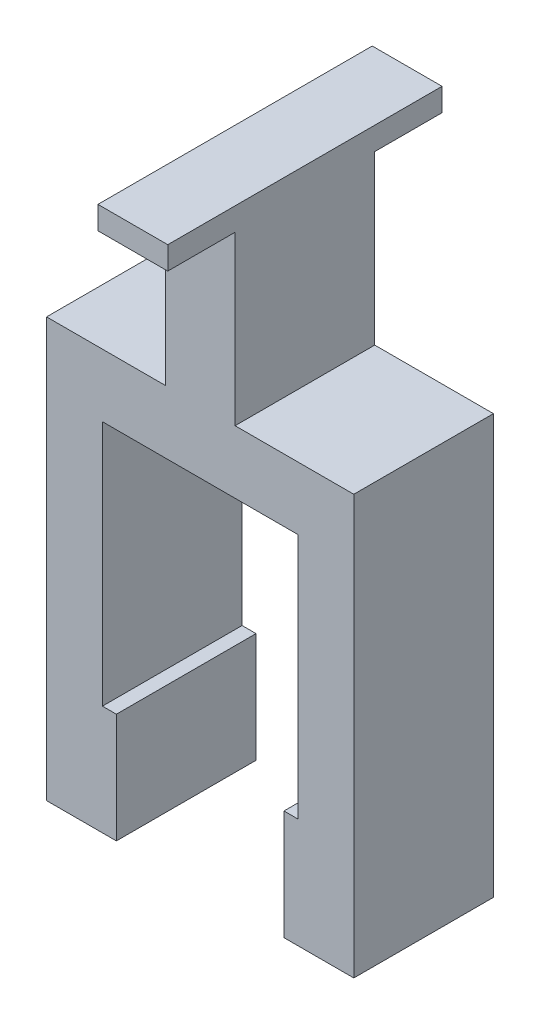
ISO-10303-21;
HEADER;
FILE_DESCRIPTION(('STEP AP214'),'2;1');
FILE_NAME('part.step','',(''),(''),'','','');
FILE_SCHEMA(('AUTOMOTIVE_DESIGN { 1 0 10303 214 1 1 1 1 }'));
ENDSEC;
DATA;
#1=APPLICATION_CONTEXT('core data for automotive mechanical design processes');
#2=APPLICATION_PROTOCOL_DEFINITION('international standard','automotive_design',2000,#1);
#3=PRODUCT_CONTEXT('',#1,'mechanical');
#4=PRODUCT('Part','Part','',(#3));
#5=PRODUCT_RELATED_PRODUCT_CATEGORY('part','',(#4));
#6=PRODUCT_DEFINITION_FORMATION('','',#4);
#7=PRODUCT_DEFINITION_CONTEXT('part definition',#1,'design');
#8=PRODUCT_DEFINITION('design','',#6,#7);
#9=PRODUCT_DEFINITION_SHAPE('','',#8);
#10=(LENGTH_UNIT() NAMED_UNIT(*) SI_UNIT(.MILLI.,.METRE.));
#11=(NAMED_UNIT(*) PLANE_ANGLE_UNIT() SI_UNIT($,.RADIAN.));
#12=(NAMED_UNIT(*) SI_UNIT($,.STERADIAN.) SOLID_ANGLE_UNIT());
#13=UNCERTAINTY_MEASURE_WITH_UNIT(LENGTH_MEASURE(1.E-05),#10,'distance_accuracy_value','');
#14=(GEOMETRIC_REPRESENTATION_CONTEXT(3) GLOBAL_UNCERTAINTY_ASSIGNED_CONTEXT((#13)) GLOBAL_UNIT_ASSIGNED_CONTEXT((#10,
#11,#12)) REPRESENTATION_CONTEXT('',''));
#15=CARTESIAN_POINT('',(0.,0.,0.));
#16=DIRECTION('',(0.,0.,1.));
#17=DIRECTION('',(1.,0.,0.));
#18=AXIS2_PLACEMENT_3D('',#15,#16,#17);
#19=CARTESIAN_POINT('',(-11.,19.4253868985056,10.));
#20=DIRECTION('',(0.,-1.,0.));
#21=DIRECTION('',(0.,0.,-1.));
#22=AXIS2_PLACEMENT_3D('',#19,#20,#21);
#23=PLANE('',#22);
#24=DIRECTION('',(0.,0.,-1.));
#25=VECTOR('',#24,1.);
#26=CARTESIAN_POINT('',(2.5,19.4253868985056,0.));
#27=LINE('',#26,#25);
#28=CARTESIAN_POINT('',(2.5,19.4253868985056,10.));
#29=VERTEX_POINT('',#28);
#30=CARTESIAN_POINT('',(2.5,19.4253868985056,0.));
#31=VERTEX_POINT('',#30);
#32=EDGE_CURVE('E55',#29,#31,#27,.T.);
#33=ORIENTED_EDGE('',*,*,#32,.F.);
#34=DIRECTION('',(-1.,0.,0.));
#35=VECTOR('',#34,1.);
#36=CARTESIAN_POINT('',(11.,19.4253868985056,10.));
#37=LINE('',#36,#35);
#38=CARTESIAN_POINT('',(11.,19.4253868985056,10.));
#39=VERTEX_POINT('',#38);
#40=EDGE_CURVE('E157',#39,#29,#37,.T.);
#41=ORIENTED_EDGE('',*,*,#40,.F.);
#42=DIRECTION('',(0.,0.,-1.));
#43=VECTOR('',#42,1.);
#44=CARTESIAN_POINT('',(11.,19.4253868985056,10.));
#45=LINE('',#44,#43);
#46=CARTESIAN_POINT('',(11.,19.4253868985056,0.));
#47=VERTEX_POINT('',#46);
#48=EDGE_CURVE('E223',#39,#47,#45,.T.);
#49=ORIENTED_EDGE('',*,*,#48,.T.);
#50=DIRECTION('',(-1.,0.,0.));
#51=VECTOR('',#50,1.);
#52=CARTESIAN_POINT('',(-11.,19.4253868985056,0.));
#53=LINE('',#52,#51);
#54=EDGE_CURVE('E206',#47,#31,#53,.T.);
#55=ORIENTED_EDGE('',*,*,#54,.T.);
#56=EDGE_LOOP('',(#33,#41,#49,#55));
#57=FACE_BOUND('',#56,.T.);
#58=ADVANCED_FACE('F39',(#57),#23,.F.);
#59=CARTESIAN_POINT('',(-6.99999999999999,-2.71543205632041,10.));
#60=DIRECTION('',(0.,-1.,0.));
#61=DIRECTION('',(0.,0.,-1.));
#62=AXIS2_PLACEMENT_3D('',#59,#60,#61);
#63=PLANE('',#62);
#64=DIRECTION('',(-1.,0.,0.));
#65=VECTOR('',#64,1.);
#66=CARTESIAN_POINT('',(-6.99999999999999,-2.71543205632041,0.));
#67=LINE('',#66,#65);
#68=CARTESIAN_POINT('',(-6.,-2.71543205632041,0.));
#69=VERTEX_POINT('',#68);
#70=CARTESIAN_POINT('',(-6.99999999999999,-2.71543205632041,0.));
#71=VERTEX_POINT('',#70);
#72=EDGE_CURVE('E178',#69,#71,#67,.T.);
#73=ORIENTED_EDGE('',*,*,#72,.T.);
#74=DIRECTION('',(0.,0.,-1.));
#75=VECTOR('',#74,1.);
#76=CARTESIAN_POINT('',(-6.99999999999999,-2.71543205632041,10.));
#77=LINE('',#76,#75);
#78=CARTESIAN_POINT('',(-6.99999999999999,-2.71543205632041,10.));
#79=VERTEX_POINT('',#78);
#80=EDGE_CURVE('E11',#79,#71,#77,.T.);
#81=ORIENTED_EDGE('',*,*,#80,.F.);
#82=DIRECTION('',(-1.,0.,0.));
#83=VECTOR('',#82,1.);
#84=CARTESIAN_POINT('',(-6.99999999999999,-2.71543205632041,10.));
#85=LINE('',#84,#83);
#86=CARTESIAN_POINT('',(-6.,-2.71543205632041,10.));
#87=VERTEX_POINT('',#86);
#88=EDGE_CURVE('E216',#87,#79,#85,.T.);
#89=ORIENTED_EDGE('',*,*,#88,.F.);
#90=DIRECTION('',(0.,0.,-1.));
#91=VECTOR('',#90,1.);
#92=CARTESIAN_POINT('',(-6.,-2.71543205632041,10.));
#93=LINE('',#92,#91);
#94=EDGE_CURVE('E174',#87,#69,#93,.T.);
#95=ORIENTED_EDGE('',*,*,#94,.T.);
#96=EDGE_LOOP('',(#73,#81,#89,#95));
#97=FACE_BOUND('',#96,.T.);
#98=ADVANCED_FACE('F41',(#97),#63,.F.);
#99=CARTESIAN_POINT('',(-7.,14.9253868985056,10.));
#100=DIRECTION('',(-1.,0.,0.));
#101=DIRECTION('',(0.,-1.,0.));
#102=AXIS2_PLACEMENT_3D('',#99,#100,#101);
#103=PLANE('',#102);
#104=DIRECTION('',(0.,1.,0.));
#105=VECTOR('',#104,1.);
#106=CARTESIAN_POINT('',(-7.,14.9253868985056,0.));
#107=LINE('',#106,#105);
#108=CARTESIAN_POINT('',(-7.,14.9253868985056,0.));
#109=VERTEX_POINT('',#108);
#110=EDGE_CURVE('E182',#71,#109,#107,.T.);
#111=ORIENTED_EDGE('',*,*,#110,.T.);
#112=DIRECTION('',(0.,0.,-1.));
#113=VECTOR('',#112,1.);
#114=CARTESIAN_POINT('',(-7.,14.9253868985056,10.));
#115=LINE('',#114,#113);
#116=CARTESIAN_POINT('',(-7.,14.9253868985056,10.));
#117=VERTEX_POINT('',#116);
#118=EDGE_CURVE('E48',#117,#109,#115,.T.);
#119=ORIENTED_EDGE('',*,*,#118,.F.);
#120=DIRECTION('',(0.,1.,0.));
#121=VECTOR('',#120,1.);
#122=CARTESIAN_POINT('',(-7.,14.9253868985056,10.));
#123=LINE('',#122,#121);
#124=EDGE_CURVE('E117',#79,#117,#123,.T.);
#125=ORIENTED_EDGE('',*,*,#124,.F.);
#126=ORIENTED_EDGE('',*,*,#80,.T.);
#127=EDGE_LOOP('',(#111,#119,#125,#126));
#128=FACE_BOUND('',#127,.T.);
#129=ADVANCED_FACE('F339',(#128),#103,.F.);
#130=CARTESIAN_POINT('',(7.,14.9253868985056,10.));
#131=DIRECTION('',(0.,1.,0.));
#132=DIRECTION('',(-1.,0.,0.));
#133=AXIS2_PLACEMENT_3D('',#130,#131,#132);
#134=PLANE('',#133);
#135=DIRECTION('',(1.,0.,0.));
#136=VECTOR('',#135,1.);
#137=CARTESIAN_POINT('',(7.,14.9253868985056,0.));
#138=LINE('',#137,#136);
#139=CARTESIAN_POINT('',(7.,14.9253868985056,0.));
#140=VERTEX_POINT('',#139);
#141=EDGE_CURVE('E186',#109,#140,#138,.T.);
#142=ORIENTED_EDGE('',*,*,#141,.T.);
#143=DIRECTION('',(0.,0.,-1.));
#144=VECTOR('',#143,1.);
#145=CARTESIAN_POINT('',(7.,14.9253868985056,10.));
#146=LINE('',#145,#144);
#147=CARTESIAN_POINT('',(7.,14.9253868985056,10.));
#148=VERTEX_POINT('',#147);
#149=EDGE_CURVE('E243',#148,#140,#146,.T.);
#150=ORIENTED_EDGE('',*,*,#149,.F.);
#151=DIRECTION('',(1.,0.,0.));
#152=VECTOR('',#151,1.);
#153=CARTESIAN_POINT('',(7.,14.9253868985056,10.));
#154=LINE('',#153,#152);
#155=EDGE_CURVE('E253',#117,#148,#154,.T.);
#156=ORIENTED_EDGE('',*,*,#155,.F.);
#157=ORIENTED_EDGE('',*,*,#118,.T.);
#158=EDGE_LOOP('',(#142,#150,#156,#157));
#159=FACE_BOUND('',#158,.T.);
#160=ADVANCED_FACE('F251',(#159),#134,.F.);
#161=CARTESIAN_POINT('',(7.,14.9253868985056,10.));
#162=DIRECTION('',(1.,0.,0.));
#163=DIRECTION('',(0.,1.,0.));
#164=AXIS2_PLACEMENT_3D('',#161,#162,#163);
#165=PLANE('',#164);
#166=DIRECTION('',(0.,-1.,0.));
#167=VECTOR('',#166,1.);
#168=CARTESIAN_POINT('',(7.,14.9253868985056,0.));
#169=LINE('',#168,#167);
#170=CARTESIAN_POINT('',(7.,-2.7154320563204,0.));
#171=VERTEX_POINT('',#170);
#172=EDGE_CURVE('E189',#140,#171,#169,.T.);
#173=ORIENTED_EDGE('',*,*,#172,.T.);
#174=DIRECTION('',(0.,0.,-1.));
#175=VECTOR('',#174,1.);
#176=CARTESIAN_POINT('',(7.,-2.7154320563204,10.));
#177=LINE('',#176,#175);
#178=CARTESIAN_POINT('',(7.,-2.7154320563204,10.));
#179=VERTEX_POINT('',#178);
#180=EDGE_CURVE('E239',#179,#171,#177,.T.);
#181=ORIENTED_EDGE('',*,*,#180,.F.);
#182=DIRECTION('',(0.,-1.,0.));
#183=VECTOR('',#182,1.);
#184=CARTESIAN_POINT('',(7.,14.9253868985056,10.));
#185=LINE('',#184,#183);
#186=EDGE_CURVE('E273',#148,#179,#185,.T.);
#187=ORIENTED_EDGE('',*,*,#186,.F.);
#188=ORIENTED_EDGE('',*,*,#149,.T.);
#189=EDGE_LOOP('',(#173,#181,#187,#188));
#190=FACE_BOUND('',#189,.T.);
#191=ADVANCED_FACE('F263',(#190),#165,.F.);
#192=CARTESIAN_POINT('',(7.,-2.7154320563204,10.));
#193=DIRECTION('',(0.,-1.,0.));
#194=DIRECTION('',(0.,0.,-1.));
#195=AXIS2_PLACEMENT_3D('',#192,#193,#194);
#196=PLANE('',#195);
#197=DIRECTION('',(-1.,0.,0.));
#198=VECTOR('',#197,1.);
#199=CARTESIAN_POINT('',(7.,-2.7154320563204,0.));
#200=LINE('',#199,#198);
#201=CARTESIAN_POINT('',(6.,-2.7154320563204,0.));
#202=VERTEX_POINT('',#201);
#203=EDGE_CURVE('E192',#171,#202,#200,.T.);
#204=ORIENTED_EDGE('',*,*,#203,.T.);
#205=DIRECTION('',(0.,0.,-1.));
#206=VECTOR('',#205,1.);
#207=CARTESIAN_POINT('',(6.,-2.7154320563204,10.));
#208=LINE('',#207,#206);
#209=CARTESIAN_POINT('',(6.,-2.7154320563204,10.));
#210=VERTEX_POINT('',#209);
#211=EDGE_CURVE('E235',#210,#202,#208,.T.);
#212=ORIENTED_EDGE('',*,*,#211,.F.);
#213=DIRECTION('',(-1.,0.,0.));
#214=VECTOR('',#213,1.);
#215=CARTESIAN_POINT('',(7.,-2.7154320563204,10.));
#216=LINE('',#215,#214);
#217=EDGE_CURVE('E269',#179,#210,#216,.T.);
#218=ORIENTED_EDGE('',*,*,#217,.F.);
#219=ORIENTED_EDGE('',*,*,#180,.T.);
#220=EDGE_LOOP('',(#204,#212,#218,#219));
#221=FACE_BOUND('',#220,.T.);
#222=ADVANCED_FACE('F267',(#221),#196,.F.);
#223=CARTESIAN_POINT('',(6.,-2.7154320563204,10.));
#224=DIRECTION('',(1.,0.,0.));
#225=DIRECTION('',(0.,1.,0.));
#226=AXIS2_PLACEMENT_3D('',#223,#224,#225);
#227=PLANE('',#226);
#228=DIRECTION('',(0.,-1.,0.));
#229=VECTOR('',#228,1.);
#230=CARTESIAN_POINT('',(6.,-2.7154320563204,0.));
#231=LINE('',#230,#229);
#232=CARTESIAN_POINT('',(6.00000000000001,-10.5746131014944,0.));
#233=VERTEX_POINT('',#232);
#234=EDGE_CURVE('E195',#202,#233,#231,.T.);
#235=ORIENTED_EDGE('',*,*,#234,.T.);
#236=DIRECTION('',(0.,0.,-1.));
#237=VECTOR('',#236,1.);
#238=CARTESIAN_POINT('',(6.00000000000001,-10.5746131014944,10.));
#239=LINE('',#238,#237);
#240=CARTESIAN_POINT('',(6.00000000000001,-10.5746131014944,10.));
#241=VERTEX_POINT('',#240);
#242=EDGE_CURVE('E231',#241,#233,#239,.T.);
#243=ORIENTED_EDGE('',*,*,#242,.F.);
#244=DIRECTION('',(0.,-1.,0.));
#245=VECTOR('',#244,1.);
#246=CARTESIAN_POINT('',(6.,-2.7154320563204,10.));
#247=LINE('',#246,#245);
#248=EDGE_CURVE('E272',#210,#241,#247,.T.);
#249=ORIENTED_EDGE('',*,*,#248,.F.);
#250=ORIENTED_EDGE('',*,*,#211,.T.);
#251=EDGE_LOOP('',(#235,#243,#249,#250));
#252=FACE_BOUND('',#251,.T.);
#253=ADVANCED_FACE('F618',(#252),#227,.F.);
#254=CARTESIAN_POINT('',(6.00000000000001,-10.5746131014944,10.));
#255=DIRECTION('',(0.,1.,0.));
#256=DIRECTION('',(0.,0.,1.));
#257=AXIS2_PLACEMENT_3D('',#254,#255,#256);
#258=PLANE('',#257);
#259=DIRECTION('',(1.,0.,0.));
#260=VECTOR('',#259,1.);
#261=CARTESIAN_POINT('',(6.00000000000001,-10.5746131014944,0.));
#262=LINE('',#261,#260);
#263=CARTESIAN_POINT('',(11.,-10.5746131014944,0.));
#264=VERTEX_POINT('',#263);
#265=EDGE_CURVE('E198',#233,#264,#262,.T.);
#266=ORIENTED_EDGE('',*,*,#265,.T.);
#267=DIRECTION('',(0.,0.,-1.));
#268=VECTOR('',#267,1.);
#269=CARTESIAN_POINT('',(11.,-10.5746131014944,10.));
#270=LINE('',#269,#268);
#271=CARTESIAN_POINT('',(11.,-10.5746131014944,10.));
#272=VERTEX_POINT('',#271);
#273=EDGE_CURVE('E227',#272,#264,#270,.T.);
#274=ORIENTED_EDGE('',*,*,#273,.F.);
#275=DIRECTION('',(1.,0.,0.));
#276=VECTOR('',#275,1.);
#277=CARTESIAN_POINT('',(6.00000000000001,-10.5746131014944,10.));
#278=LINE('',#277,#276);
#279=EDGE_CURVE('E277',#241,#272,#278,.T.);
#280=ORIENTED_EDGE('',*,*,#279,.F.);
#281=ORIENTED_EDGE('',*,*,#242,.T.);
#282=EDGE_LOOP('',(#266,#274,#280,#281));
#283=FACE_BOUND('',#282,.T.);
#284=ADVANCED_FACE('F360',(#283),#258,.F.);
#285=CARTESIAN_POINT('',(11.,-10.5746131014944,10.));
#286=DIRECTION('',(-1.,0.,0.));
#287=DIRECTION('',(0.,-1.,0.));
#288=AXIS2_PLACEMENT_3D('',#285,#286,#287);
#289=PLANE('',#288);
#290=DIRECTION('',(0.,1.,0.));
#291=VECTOR('',#290,1.);
#292=CARTESIAN_POINT('',(11.,-10.5746131014944,0.));
#293=LINE('',#292,#291);
#294=EDGE_CURVE('E201',#264,#47,#293,.T.);
#295=ORIENTED_EDGE('',*,*,#294,.T.);
#296=ORIENTED_EDGE('',*,*,#48,.F.);
#297=DIRECTION('',(0.,1.,0.));
#298=VECTOR('',#297,1.);
#299=CARTESIAN_POINT('',(11.,-10.5746131014944,10.));
#300=LINE('',#299,#298);
#301=EDGE_CURVE('E284',#272,#39,#300,.T.);
#302=ORIENTED_EDGE('',*,*,#301,.F.);
#303=ORIENTED_EDGE('',*,*,#273,.T.);
#304=EDGE_LOOP('',(#295,#296,#302,#303));
#305=FACE_BOUND('',#304,.T.);
#306=ADVANCED_FACE('F354',(#305),#289,.F.);
#307=CARTESIAN_POINT('',(-2.5,19.4253868985056,10.));
#308=VERTEX_POINT('',#307);
#309=CARTESIAN_POINT('',(-11.,19.4253868985056,10.));
#310=VERTEX_POINT('',#309);
#311=EDGE_CURVE('E152',#308,#310,#37,.T.);
#312=ORIENTED_EDGE('',*,*,#311,.F.);
#313=DIRECTION('',(0.,0.,-1.));
#314=VECTOR('',#313,1.);
#315=CARTESIAN_POINT('',(-2.5,19.4253868985056,0.));
#316=LINE('',#315,#314);
#317=CARTESIAN_POINT('',(-2.5,19.4253868985056,0.));
#318=VERTEX_POINT('',#317);
#319=EDGE_CURVE('E366',#308,#318,#316,.T.);
#320=ORIENTED_EDGE('',*,*,#319,.T.);
#321=CARTESIAN_POINT('',(-11.,19.4253868985056,0.));
#322=VERTEX_POINT('',#321);
#323=EDGE_CURVE('E205',#318,#322,#53,.T.);
#324=ORIENTED_EDGE('',*,*,#323,.T.);
#325=DIRECTION('',(0.,0.,-1.));
#326=VECTOR('',#325,1.);
#327=CARTESIAN_POINT('',(-11.,19.4253868985056,10.));
#328=LINE('',#327,#326);
#329=EDGE_CURVE('E167',#310,#322,#328,.T.);
#330=ORIENTED_EDGE('',*,*,#329,.F.);
#331=EDGE_LOOP('',(#312,#320,#324,#330));
#332=FACE_BOUND('',#331,.T.);
#333=ADVANCED_FACE('F348',(#332),#23,.F.);
#334=CARTESIAN_POINT('',(-11.,-10.5746131014944,10.));
#335=DIRECTION('',(1.,0.,0.));
#336=DIRECTION('',(0.,0.,-1.));
#337=AXIS2_PLACEMENT_3D('',#334,#335,#336);
#338=PLANE('',#337);
#339=DIRECTION('',(0.,-1.,0.));
#340=VECTOR('',#339,1.);
#341=CARTESIAN_POINT('',(-11.,-10.5746131014944,0.));
#342=LINE('',#341,#340);
#343=CARTESIAN_POINT('',(-11.,-10.5746131014944,0.));
#344=VERTEX_POINT('',#343);
#345=EDGE_CURVE('E163',#322,#344,#342,.T.);
#346=ORIENTED_EDGE('',*,*,#345,.T.);
#347=DIRECTION('',(0.,0.,-1.));
#348=VECTOR('',#347,1.);
#349=CARTESIAN_POINT('',(-11.,-10.5746131014944,10.));
#350=LINE('',#349,#348);
#351=CARTESIAN_POINT('',(-11.,-10.5746131014944,10.));
#352=VERTEX_POINT('',#351);
#353=EDGE_CURVE('E160',#352,#344,#350,.T.);
#354=ORIENTED_EDGE('',*,*,#353,.F.);
#355=DIRECTION('',(0.,-1.,0.));
#356=VECTOR('',#355,1.);
#357=CARTESIAN_POINT('',(-11.,-10.5746131014944,10.));
#358=LINE('',#357,#356);
#359=EDGE_CURVE('E144',#310,#352,#358,.T.);
#360=ORIENTED_EDGE('',*,*,#359,.F.);
#361=ORIENTED_EDGE('',*,*,#329,.T.);
#362=EDGE_LOOP('',(#346,#354,#360,#361));
#363=FACE_BOUND('',#362,.T.);
#364=ADVANCED_FACE('F161',(#363),#338,.F.);
#365=CARTESIAN_POINT('',(-5.99999999999999,-10.5746131014944,10.));
#366=DIRECTION('',(0.,1.,0.));
#367=DIRECTION('',(-1.,0.,0.));
#368=AXIS2_PLACEMENT_3D('',#365,#366,#367);
#369=PLANE('',#368);
#370=DIRECTION('',(1.,0.,0.));
#371=VECTOR('',#370,1.);
#372=CARTESIAN_POINT('',(-5.99999999999999,-10.5746131014944,0.));
#373=LINE('',#372,#371);
#374=CARTESIAN_POINT('',(-5.99999999999999,-10.5746131014944,0.));
#375=VERTEX_POINT('',#374);
#376=EDGE_CURVE('E211',#344,#375,#373,.T.);
#377=ORIENTED_EDGE('',*,*,#376,.T.);
#378=DIRECTION('',(0.,0.,-1.));
#379=VECTOR('',#378,1.);
#380=CARTESIAN_POINT('',(-5.99999999999999,-10.5746131014944,10.));
#381=LINE('',#380,#379);
#382=CARTESIAN_POINT('',(-5.99999999999999,-10.5746131014944,10.));
#383=VERTEX_POINT('',#382);
#384=EDGE_CURVE('E168',#383,#375,#381,.T.);
#385=ORIENTED_EDGE('',*,*,#384,.F.);
#386=DIRECTION('',(1.,0.,0.));
#387=VECTOR('',#386,1.);
#388=CARTESIAN_POINT('',(-5.99999999999999,-10.5746131014944,10.));
#389=LINE('',#388,#387);
#390=EDGE_CURVE('E149',#352,#383,#389,.T.);
#391=ORIENTED_EDGE('',*,*,#390,.F.);
#392=ORIENTED_EDGE('',*,*,#353,.T.);
#393=EDGE_LOOP('',(#377,#385,#391,#392));
#394=FACE_BOUND('',#393,.T.);
#395=ADVANCED_FACE('F170',(#394),#369,.F.);
#396=CARTESIAN_POINT('',(-6.,-2.71543205632041,10.));
#397=DIRECTION('',(-1.,0.,0.));
#398=DIRECTION('',(0.,-1.,0.));
#399=AXIS2_PLACEMENT_3D('',#396,#397,#398);
#400=PLANE('',#399);
#401=DIRECTION('',(0.,1.,0.));
#402=VECTOR('',#401,1.);
#403=CARTESIAN_POINT('',(-6.,-2.71543205632041,0.));
#404=LINE('',#403,#402);
#405=EDGE_CURVE('E109',#375,#69,#404,.T.);
#406=ORIENTED_EDGE('',*,*,#405,.T.);
#407=ORIENTED_EDGE('',*,*,#94,.F.);
#408=DIRECTION('',(0.,1.,0.));
#409=VECTOR('',#408,1.);
#410=CARTESIAN_POINT('',(-6.,-2.71543205632041,10.));
#411=LINE('',#410,#409);
#412=EDGE_CURVE('E64',#383,#87,#411,.T.);
#413=ORIENTED_EDGE('',*,*,#412,.F.);
#414=ORIENTED_EDGE('',*,*,#384,.T.);
#415=EDGE_LOOP('',(#406,#407,#413,#414));
#416=FACE_BOUND('',#415,.T.);
#417=ADVANCED_FACE('F478',(#416),#400,.F.);
#418=CARTESIAN_POINT('',(0.,0.,10.));
#419=DIRECTION('',(0.,0.,-1.));
#420=DIRECTION('',(-1.,0.,0.));
#421=AXIS2_PLACEMENT_3D('',#418,#419,#420);
#422=PLANE('',#421);
#423=DIRECTION('',(0.,-1.,0.));
#424=VECTOR('',#423,1.);
#425=CARTESIAN_POINT('',(-2.5,19.4253868985056,10.));
#426=LINE('',#425,#424);
#427=CARTESIAN_POINT('',(-2.5,31.4253868985056,10.));
#428=VERTEX_POINT('',#427);
#429=EDGE_CURVE('E404',#428,#308,#426,.T.);
#430=ORIENTED_EDGE('',*,*,#429,.T.);
#431=ORIENTED_EDGE('',*,*,#311,.T.);
#432=ORIENTED_EDGE('',*,*,#359,.T.);
#433=ORIENTED_EDGE('',*,*,#390,.T.);
#434=ORIENTED_EDGE('',*,*,#412,.T.);
#435=ORIENTED_EDGE('',*,*,#88,.T.);
#436=ORIENTED_EDGE('',*,*,#124,.T.);
#437=ORIENTED_EDGE('',*,*,#155,.T.);
#438=ORIENTED_EDGE('',*,*,#186,.T.);
#439=ORIENTED_EDGE('',*,*,#217,.T.);
#440=ORIENTED_EDGE('',*,*,#248,.T.);
#441=ORIENTED_EDGE('',*,*,#279,.T.);
#442=ORIENTED_EDGE('',*,*,#301,.T.);
#443=ORIENTED_EDGE('',*,*,#40,.T.);
#444=DIRECTION('',(0.,-1.,0.));
#445=VECTOR('',#444,1.);
#446=CARTESIAN_POINT('',(2.5,19.4253868985056,10.));
#447=LINE('',#446,#445);
#448=CARTESIAN_POINT('',(2.5,31.4253868985056,10.));
#449=VERTEX_POINT('',#448);
#450=EDGE_CURVE('E291',#449,#29,#447,.T.);
#451=ORIENTED_EDGE('',*,*,#450,.F.);
#452=DIRECTION('',(-1.,0.,0.));
#453=VECTOR('',#452,1.);
#454=CARTESIAN_POINT('',(2.5,31.4253868985056,10.));
#455=LINE('',#454,#453);
#456=EDGE_CURVE('E304',#449,#428,#455,.T.);
#457=ORIENTED_EDGE('',*,*,#456,.T.);
#458=EDGE_LOOP('',(#430,#431,#432,#433,#434,#435,#436,#437,#438,#439,#440,#441,#442,#443,#451,#457));
#459=FACE_BOUND('',#458,.T.);
#460=ADVANCED_FACE('F147',(#459),#422,.F.);
#461=CARTESIAN_POINT('',(0.,0.,0.));
#462=DIRECTION('',(0.,0.,-1.));
#463=DIRECTION('',(-1.,0.,0.));
#464=AXIS2_PLACEMENT_3D('',#461,#462,#463);
#465=PLANE('',#464);
#466=ORIENTED_EDGE('',*,*,#323,.F.);
#467=DIRECTION('',(0.,1.,0.));
#468=VECTOR('',#467,1.);
#469=CARTESIAN_POINT('',(-2.5,19.4253868985056,0.));
#470=LINE('',#469,#468);
#471=CARTESIAN_POINT('',(-2.5,31.4253868985056,0.));
#472=VERTEX_POINT('',#471);
#473=EDGE_CURVE('E451',#318,#472,#470,.T.);
#474=ORIENTED_EDGE('',*,*,#473,.T.);
#475=DIRECTION('',(-1.,0.,0.));
#476=VECTOR('',#475,1.);
#477=CARTESIAN_POINT('',(2.5,31.4253868985056,0.));
#478=LINE('',#477,#476);
#479=CARTESIAN_POINT('',(2.5,31.4253868985056,0.));
#480=VERTEX_POINT('',#479);
#481=EDGE_CURVE('E183',#480,#472,#478,.T.);
#482=ORIENTED_EDGE('',*,*,#481,.F.);
#483=DIRECTION('',(0.,1.,0.));
#484=VECTOR('',#483,1.);
#485=CARTESIAN_POINT('',(2.5,19.4253868985056,0.));
#486=LINE('',#485,#484);
#487=EDGE_CURVE('E409',#31,#480,#486,.T.);
#488=ORIENTED_EDGE('',*,*,#487,.F.);
#489=ORIENTED_EDGE('',*,*,#54,.F.);
#490=ORIENTED_EDGE('',*,*,#294,.F.);
#491=ORIENTED_EDGE('',*,*,#265,.F.);
#492=ORIENTED_EDGE('',*,*,#234,.F.);
#493=ORIENTED_EDGE('',*,*,#203,.F.);
#494=ORIENTED_EDGE('',*,*,#172,.F.);
#495=ORIENTED_EDGE('',*,*,#141,.F.);
#496=ORIENTED_EDGE('',*,*,#110,.F.);
#497=ORIENTED_EDGE('',*,*,#72,.F.);
#498=ORIENTED_EDGE('',*,*,#405,.F.);
#499=ORIENTED_EDGE('',*,*,#376,.F.);
#500=ORIENTED_EDGE('',*,*,#345,.F.);
#501=EDGE_LOOP('',(#466,#474,#482,#488,#489,#490,#491,#492,#493,#494,#495,#496,#497,#498,#499,#500));
#502=FACE_BOUND('',#501,.T.);
#503=ADVANCED_FACE('F257',(#502),#465,.T.);
#504=CARTESIAN_POINT('',(2.5,31.4253868985056,0.));
#505=DIRECTION('',(0.,1.,0.));
#506=DIRECTION('',(0.,0.,1.));
#507=AXIS2_PLACEMENT_3D('',#504,#505,#506);
#508=PLANE('',#507);
#509=ORIENTED_EDGE('',*,*,#481,.T.);
#510=DIRECTION('',(0.,0.,-1.));
#511=VECTOR('',#510,1.);
#512=CARTESIAN_POINT('',(-2.5,31.4253868985056,0.));
#513=LINE('',#512,#511);
#514=CARTESIAN_POINT('',(-2.5,31.4253868985056,-4.82120909816652));
#515=VERTEX_POINT('',#514);
#516=EDGE_CURVE('E447',#472,#515,#513,.T.);
#517=ORIENTED_EDGE('',*,*,#516,.T.);
#518=DIRECTION('',(-1.,0.,0.));
#519=VECTOR('',#518,1.);
#520=CARTESIAN_POINT('',(2.5,31.4253868985056,-4.82120909816652));
#521=LINE('',#520,#519);
#522=CARTESIAN_POINT('',(2.5,31.4253868985056,-4.82120909816652));
#523=VERTEX_POINT('',#522);
#524=EDGE_CURVE('E325',#523,#515,#521,.T.);
#525=ORIENTED_EDGE('',*,*,#524,.F.);
#526=DIRECTION('',(0.,0.,-1.));
#527=VECTOR('',#526,1.);
#528=CARTESIAN_POINT('',(2.5,31.4253868985056,0.));
#529=LINE('',#528,#527);
#530=EDGE_CURVE('E416',#480,#523,#529,.T.);
#531=ORIENTED_EDGE('',*,*,#530,.F.);
#532=EDGE_LOOP('',(#509,#517,#525,#531));
#533=FACE_BOUND('',#532,.T.);
#534=ADVANCED_FACE('F466',(#533),#508,.F.);
#535=CARTESIAN_POINT('',(2.5,31.4253868985056,-4.82120909816652));
#536=DIRECTION('',(0.,0.,1.));
#537=DIRECTION('',(1.,0.,0.));
#538=AXIS2_PLACEMENT_3D('',#535,#536,#537);
#539=PLANE('',#538);
#540=ORIENTED_EDGE('',*,*,#524,.T.);
#541=DIRECTION('',(0.,1.,0.));
#542=VECTOR('',#541,1.);
#543=CARTESIAN_POINT('',(-2.5,31.4253868985056,-4.82120909816652));
#544=LINE('',#543,#542);
#545=CARTESIAN_POINT('',(-2.5,33.0637005879719,-4.82120909816652));
#546=VERTEX_POINT('',#545);
#547=EDGE_CURVE('E432',#515,#546,#544,.T.);
#548=ORIENTED_EDGE('',*,*,#547,.T.);
#549=DIRECTION('',(-1.,0.,0.));
#550=VECTOR('',#549,1.);
#551=CARTESIAN_POINT('',(2.5,33.0637005879719,-4.82120909816652));
#552=LINE('',#551,#550);
#553=CARTESIAN_POINT('',(2.5,33.0637005879719,-4.82120909816652));
#554=VERTEX_POINT('',#553);
#555=EDGE_CURVE('E321',#554,#546,#552,.T.);
#556=ORIENTED_EDGE('',*,*,#555,.F.);
#557=DIRECTION('',(0.,1.,0.));
#558=VECTOR('',#557,1.);
#559=CARTESIAN_POINT('',(2.5,31.4253868985056,-4.82120909816652));
#560=LINE('',#559,#558);
#561=EDGE_CURVE('E419',#523,#554,#560,.T.);
#562=ORIENTED_EDGE('',*,*,#561,.F.);
#563=EDGE_LOOP('',(#540,#548,#556,#562));
#564=FACE_BOUND('',#563,.T.);
#565=ADVANCED_FACE('F429',(#564),#539,.F.);
#566=CARTESIAN_POINT('',(2.5,33.0637005879719,14.8212090981665));
#567=DIRECTION('',(0.,-1.,0.));
#568=DIRECTION('',(0.,0.,-1.));
#569=AXIS2_PLACEMENT_3D('',#566,#567,#568);
#570=PLANE('',#569);
#571=ORIENTED_EDGE('',*,*,#555,.T.);
#572=DIRECTION('',(0.,0.,1.));
#573=VECTOR('',#572,1.);
#574=CARTESIAN_POINT('',(-2.5,33.0637005879719,14.8212090981665));
#575=LINE('',#574,#573);
#576=CARTESIAN_POINT('',(-2.5,33.0637005879719,14.8212090981665));
#577=VERTEX_POINT('',#576);
#578=EDGE_CURVE('E438',#546,#577,#575,.T.);
#579=ORIENTED_EDGE('',*,*,#578,.T.);
#580=DIRECTION('',(-1.,0.,0.));
#581=VECTOR('',#580,1.);
#582=CARTESIAN_POINT('',(2.5,33.0637005879719,14.8212090981665));
#583=LINE('',#582,#581);
#584=CARTESIAN_POINT('',(2.5,33.0637005879719,14.8212090981665));
#585=VERTEX_POINT('',#584);
#586=EDGE_CURVE('E317',#585,#577,#583,.T.);
#587=ORIENTED_EDGE('',*,*,#586,.F.);
#588=DIRECTION('',(0.,0.,1.));
#589=VECTOR('',#588,1.);
#590=CARTESIAN_POINT('',(2.5,33.0637005879719,14.8212090981665));
#591=LINE('',#590,#589);
#592=EDGE_CURVE('E391',#554,#585,#591,.T.);
#593=ORIENTED_EDGE('',*,*,#592,.F.);
#594=EDGE_LOOP('',(#571,#579,#587,#593));
#595=FACE_BOUND('',#594,.T.);
#596=ADVANCED_FACE('F436',(#595),#570,.F.);
#597=CARTESIAN_POINT('',(2.5,31.4253868985056,14.8212090981665));
#598=DIRECTION('',(0.,0.,-1.));
#599=DIRECTION('',(-1.,0.,0.));
#600=AXIS2_PLACEMENT_3D('',#597,#598,#599);
#601=PLANE('',#600);
#602=ORIENTED_EDGE('',*,*,#586,.T.);
#603=DIRECTION('',(0.,-1.,0.));
#604=VECTOR('',#603,1.);
#605=CARTESIAN_POINT('',(-2.5,31.4253868985056,14.8212090981665));
#606=LINE('',#605,#604);
#607=CARTESIAN_POINT('',(-2.5,31.4253868985056,14.8212090981665));
#608=VERTEX_POINT('',#607);
#609=EDGE_CURVE('E398',#577,#608,#606,.T.);
#610=ORIENTED_EDGE('',*,*,#609,.T.);
#611=DIRECTION('',(-1.,0.,0.));
#612=VECTOR('',#611,1.);
#613=CARTESIAN_POINT('',(2.5,31.4253868985056,14.8212090981665));
#614=LINE('',#613,#612);
#615=CARTESIAN_POINT('',(2.5,31.4253868985056,14.8212090981665));
#616=VERTEX_POINT('',#615);
#617=EDGE_CURVE('E308',#616,#608,#614,.T.);
#618=ORIENTED_EDGE('',*,*,#617,.F.);
#619=DIRECTION('',(0.,-1.,0.));
#620=VECTOR('',#619,1.);
#621=CARTESIAN_POINT('',(2.5,31.4253868985056,14.8212090981665));
#622=LINE('',#621,#620);
#623=EDGE_CURVE('E310',#585,#616,#622,.T.);
#624=ORIENTED_EDGE('',*,*,#623,.F.);
#625=EDGE_LOOP('',(#602,#610,#618,#624));
#626=FACE_BOUND('',#625,.T.);
#627=ADVANCED_FACE('F396',(#626),#601,.F.);
#628=CARTESIAN_POINT('',(2.5,31.4253868985056,10.));
#629=DIRECTION('',(0.,1.,0.));
#630=DIRECTION('',(0.,0.,1.));
#631=AXIS2_PLACEMENT_3D('',#628,#629,#630);
#632=PLANE('',#631);
#633=ORIENTED_EDGE('',*,*,#617,.T.);
#634=DIRECTION('',(0.,0.,-1.));
#635=VECTOR('',#634,1.);
#636=CARTESIAN_POINT('',(-2.5,31.4253868985056,10.));
#637=LINE('',#636,#635);
#638=EDGE_CURVE('E403',#608,#428,#637,.T.);
#639=ORIENTED_EDGE('',*,*,#638,.T.);
#640=ORIENTED_EDGE('',*,*,#456,.F.);
#641=DIRECTION('',(0.,0.,-1.));
#642=VECTOR('',#641,1.);
#643=CARTESIAN_POINT('',(2.5,31.4253868985056,10.));
#644=LINE('',#643,#642);
#645=EDGE_CURVE('E301',#616,#449,#644,.T.);
#646=ORIENTED_EDGE('',*,*,#645,.F.);
#647=EDGE_LOOP('',(#633,#639,#640,#646));
#648=FACE_BOUND('',#647,.T.);
#649=ADVANCED_FACE('F402',(#648),#632,.F.);
#650=CARTESIAN_POINT('',(2.5,0.,0.));
#651=DIRECTION('',(-1.,0.,0.));
#652=DIRECTION('',(0.,0.,1.));
#653=AXIS2_PLACEMENT_3D('',#650,#651,#652);
#654=PLANE('',#653);
#655=ORIENTED_EDGE('',*,*,#32,.T.);
#656=ORIENTED_EDGE('',*,*,#487,.T.);
#657=ORIENTED_EDGE('',*,*,#530,.T.);
#658=ORIENTED_EDGE('',*,*,#561,.T.);
#659=ORIENTED_EDGE('',*,*,#592,.T.);
#660=ORIENTED_EDGE('',*,*,#623,.T.);
#661=ORIENTED_EDGE('',*,*,#645,.T.);
#662=ORIENTED_EDGE('',*,*,#450,.T.);
#663=EDGE_LOOP('',(#655,#656,#657,#658,#659,#660,#661,#662));
#664=FACE_BOUND('',#663,.T.);
#665=ADVANCED_FACE('F296',(#664),#654,.F.);
#666=CARTESIAN_POINT('',(-2.5,0.,0.));
#667=DIRECTION('',(-1.,0.,0.));
#668=DIRECTION('',(0.,0.,1.));
#669=AXIS2_PLACEMENT_3D('',#666,#667,#668);
#670=PLANE('',#669);
#671=ORIENTED_EDGE('',*,*,#319,.F.);
#672=ORIENTED_EDGE('',*,*,#429,.F.);
#673=ORIENTED_EDGE('',*,*,#638,.F.);
#674=ORIENTED_EDGE('',*,*,#609,.F.);
#675=ORIENTED_EDGE('',*,*,#578,.F.);
#676=ORIENTED_EDGE('',*,*,#547,.F.);
#677=ORIENTED_EDGE('',*,*,#516,.F.);
#678=ORIENTED_EDGE('',*,*,#473,.F.);
#679=EDGE_LOOP('',(#671,#672,#673,#674,#675,#676,#677,#678));
#680=FACE_BOUND('',#679,.T.);
#681=ADVANCED_FACE('F440',(#680),#670,.T.);
#682=CLOSED_SHELL('',(#58,#98,#129,#160,#191,#222,#253,#284,#306,#333,#364,#395,#417,#460,#503,
#534,#565,#596,#627,#649,#665,#681));
#683=MANIFOLD_SOLID_BREP('B2',#682);
#684=ADVANCED_BREP_SHAPE_REPRESENTATION('',(#18,#683),#14);
#685=SHAPE_DEFINITION_REPRESENTATION(#9,#684);
ENDSEC;
END-ISO-10303-21;
